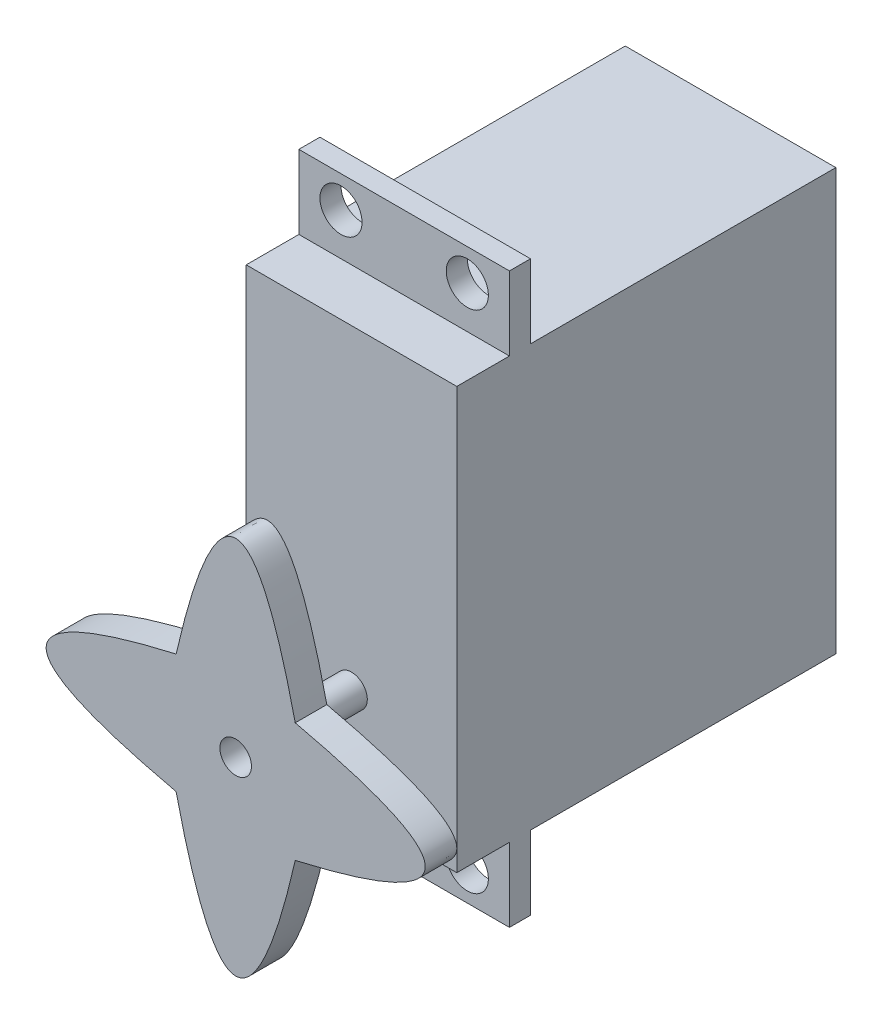
ISO-10303-21;
HEADER;
FILE_DESCRIPTION(('STEP AP214'),'2;1');
FILE_NAME('part.step','',(''),(''),'','','');
FILE_SCHEMA(('AUTOMOTIVE_DESIGN { 1 0 10303 214 1 1 1 1 }'));
ENDSEC;
DATA;
#1=APPLICATION_CONTEXT('core data for automotive mechanical design processes');
#2=APPLICATION_PROTOCOL_DEFINITION('international standard','automotive_design',2000,#1);
#3=PRODUCT_CONTEXT('',#1,'mechanical');
#4=PRODUCT('Part','Part','',(#3));
#5=PRODUCT_RELATED_PRODUCT_CATEGORY('part','',(#4));
#6=PRODUCT_DEFINITION_FORMATION('','',#4);
#7=PRODUCT_DEFINITION_CONTEXT('part definition',#1,'design');
#8=PRODUCT_DEFINITION('design','',#6,#7);
#9=PRODUCT_DEFINITION_SHAPE('','',#8);
#10=(LENGTH_UNIT() NAMED_UNIT(*) SI_UNIT(.MILLI.,.METRE.));
#11=(NAMED_UNIT(*) PLANE_ANGLE_UNIT() SI_UNIT($,.RADIAN.));
#12=(NAMED_UNIT(*) SI_UNIT($,.STERADIAN.) SOLID_ANGLE_UNIT());
#13=UNCERTAINTY_MEASURE_WITH_UNIT(LENGTH_MEASURE(1.E-05),#10,'distance_accuracy_value','');
#14=(GEOMETRIC_REPRESENTATION_CONTEXT(3) GLOBAL_UNCERTAINTY_ASSIGNED_CONTEXT((#13)) GLOBAL_UNIT_ASSIGNED_CONTEXT((#10,
#11,#12)) REPRESENTATION_CONTEXT('',''));
#15=CARTESIAN_POINT('',(0.,0.,0.));
#16=DIRECTION('',(0.,0.,1.));
#17=DIRECTION('',(1.,0.,0.));
#18=AXIS2_PLACEMENT_3D('',#15,#16,#17);
#19=CARTESIAN_POINT('',(15.6568542494924,4.34314575050762,47.));
#20=CARTESIAN_POINT('',(40.3431457505076,10.,47.));
#21=CARTESIAN_POINT('',(15.6568542494924,15.6568542494924,47.));
#22=B_SPLINE_CURVE_WITH_KNOTS('',2,(#19,#20,#21),.UNSPECIFIED.,.F.,.F.,(3,3),(0.,1.),.UNSPECIFIED.);
#23=DIRECTION('',(0.,0.,-1.));
#24=VECTOR('',#23,1.);
#25=SURFACE_OF_LINEAR_EXTRUSION('',#22,#24);
#26=CARTESIAN_POINT('',(15.6568542494924,4.34314575050762,44.));
#27=CARTESIAN_POINT('',(40.3431457505076,10.,44.));
#28=CARTESIAN_POINT('',(15.6568542494924,15.6568542494924,44.));
#29=B_SPLINE_CURVE_WITH_KNOTS('',2,(#26,#27,#28),.UNSPECIFIED.,.F.,.F.,(3,3),(0.,1.),.UNSPECIFIED.);
#30=CARTESIAN_POINT('',(15.6568542494923,4.34314575050757,44.));
#31=VERTEX_POINT('',#30);
#32=CARTESIAN_POINT('',(15.6568542494924,15.6568542494924,44.));
#33=VERTEX_POINT('',#32);
#34=EDGE_CURVE('E136',#31,#33,#29,.T.);
#35=ORIENTED_EDGE('',*,*,#34,.T.);
#36=DIRECTION('',(0.,0.,-1.));
#37=VECTOR('',#36,1.);
#38=CARTESIAN_POINT('',(15.6568542494924,15.6568542494924,47.));
#39=LINE('',#38,#37);
#40=CARTESIAN_POINT('',(15.6568542494924,15.6568542494924,47.));
#41=VERTEX_POINT('',#40);
#42=EDGE_CURVE('E12',#41,#33,#39,.T.);
#43=ORIENTED_EDGE('',*,*,#42,.F.);
#44=CARTESIAN_POINT('',(15.6568542494923,4.34314575050757,47.));
#45=VERTEX_POINT('',#44);
#46=EDGE_CURVE('E87',#45,#41,#22,.T.);
#47=ORIENTED_EDGE('',*,*,#46,.F.);
#48=DIRECTION('',(0.,0.,-1.));
#49=VECTOR('',#48,1.);
#50=CARTESIAN_POINT('',(15.6568542494923,4.34314575050757,47.));
#51=LINE('',#50,#49);
#52=EDGE_CURVE('E137',#45,#31,#51,.T.);
#53=ORIENTED_EDGE('',*,*,#52,.T.);
#54=EDGE_LOOP('',(#35,#43,#47,#53));
#55=FACE_BOUND('',#54,.T.);
#56=ADVANCED_FACE('F47',(#55),#25,.F.);
#57=CARTESIAN_POINT('',(4.34314575050761,15.6568542494924,47.));
#58=CARTESIAN_POINT('',(9.99999999999999,40.3431457505076,47.));
#59=CARTESIAN_POINT('',(15.6568542494924,15.6568542494924,47.));
#60=B_SPLINE_CURVE_WITH_KNOTS('',2,(#57,#58,#59),.UNSPECIFIED.,.F.,.F.,(3,3),(0.,1.),.UNSPECIFIED.);
#61=DIRECTION('',(0.,0.,-1.));
#62=VECTOR('',#61,1.);
#63=SURFACE_OF_LINEAR_EXTRUSION('',#60,#62);
#64=CARTESIAN_POINT('',(4.34314575050761,15.6568542494924,44.));
#65=CARTESIAN_POINT('',(9.99999999999999,40.3431457505076,44.));
#66=CARTESIAN_POINT('',(15.6568542494924,15.6568542494924,44.));
#67=B_SPLINE_CURVE_WITH_KNOTS('',2,(#64,#65,#66),.UNSPECIFIED.,.F.,.F.,(3,3),(0.,1.),.UNSPECIFIED.);
#68=CARTESIAN_POINT('',(4.34314575050763,15.6568542494924,44.));
#69=VERTEX_POINT('',#68);
#70=EDGE_CURVE('E96',#69,#33,#67,.T.);
#71=ORIENTED_EDGE('',*,*,#70,.F.);
#72=DIRECTION('',(0.,0.,-1.));
#73=VECTOR('',#72,1.);
#74=CARTESIAN_POINT('',(4.34314575050763,15.6568542494924,47.));
#75=LINE('',#74,#73);
#76=CARTESIAN_POINT('',(4.34314575050763,15.6568542494924,47.));
#77=VERTEX_POINT('',#76);
#78=EDGE_CURVE('E56',#77,#69,#75,.T.);
#79=ORIENTED_EDGE('',*,*,#78,.F.);
#80=EDGE_CURVE('E94',#77,#41,#60,.T.);
#81=ORIENTED_EDGE('',*,*,#80,.T.);
#82=ORIENTED_EDGE('',*,*,#42,.T.);
#83=EDGE_LOOP('',(#71,#79,#81,#82));
#84=FACE_BOUND('',#83,.T.);
#85=ADVANCED_FACE('F93',(#84),#63,.T.);
#86=CARTESIAN_POINT('',(4.34314575050762,4.34314575050761,47.));
#87=CARTESIAN_POINT('',(-20.3431457505076,10.,47.));
#88=CARTESIAN_POINT('',(4.34314575050761,15.6568542494924,47.));
#89=B_SPLINE_CURVE_WITH_KNOTS('',2,(#86,#87,#88),.UNSPECIFIED.,.F.,.F.,(3,3),(0.,1.),.UNSPECIFIED.);
#90=DIRECTION('',(0.,0.,-1.));
#91=VECTOR('',#90,1.);
#92=SURFACE_OF_LINEAR_EXTRUSION('',#89,#91);
#93=CARTESIAN_POINT('',(4.34314575050762,4.34314575050761,44.));
#94=CARTESIAN_POINT('',(-20.3431457505076,10.,44.));
#95=CARTESIAN_POINT('',(4.34314575050761,15.6568542494924,44.));
#96=B_SPLINE_CURVE_WITH_KNOTS('',2,(#93,#94,#95),.UNSPECIFIED.,.F.,.F.,(3,3),(0.,1.),.UNSPECIFIED.);
#97=CARTESIAN_POINT('',(4.34314575050755,4.34314575050769,44.));
#98=VERTEX_POINT('',#97);
#99=EDGE_CURVE('E142',#98,#69,#96,.T.);
#100=ORIENTED_EDGE('',*,*,#99,.F.);
#101=DIRECTION('',(0.,0.,-1.));
#102=VECTOR('',#101,1.);
#103=CARTESIAN_POINT('',(4.34314575050755,4.34314575050769,47.));
#104=LINE('',#103,#102);
#105=CARTESIAN_POINT('',(4.34314575050755,4.34314575050769,47.));
#106=VERTEX_POINT('',#105);
#107=EDGE_CURVE('E79',#106,#98,#104,.T.);
#108=ORIENTED_EDGE('',*,*,#107,.F.);
#109=EDGE_CURVE('E103',#106,#77,#89,.T.);
#110=ORIENTED_EDGE('',*,*,#109,.T.);
#111=ORIENTED_EDGE('',*,*,#78,.T.);
#112=EDGE_LOOP('',(#100,#108,#110,#111));
#113=FACE_BOUND('',#112,.T.);
#114=ADVANCED_FACE('F105',(#113),#92,.T.);
#115=CARTESIAN_POINT('',(4.34314575050762,4.34314575050761,47.));
#116=CARTESIAN_POINT('',(10.,-20.3431457505076,47.));
#117=CARTESIAN_POINT('',(15.6568542494924,4.34314575050762,47.));
#118=B_SPLINE_CURVE_WITH_KNOTS('',2,(#115,#116,#117),.UNSPECIFIED.,.F.,.F.,(3,3),(0.,1.),.UNSPECIFIED.);
#119=DIRECTION('',(0.,0.,-1.));
#120=VECTOR('',#119,1.);
#121=SURFACE_OF_LINEAR_EXTRUSION('',#118,#120);
#122=CARTESIAN_POINT('',(4.34314575050762,4.34314575050761,44.));
#123=CARTESIAN_POINT('',(10.,-20.3431457505076,44.));
#124=CARTESIAN_POINT('',(15.6568542494924,4.34314575050762,44.));
#125=B_SPLINE_CURVE_WITH_KNOTS('',2,(#122,#123,#124),.UNSPECIFIED.,.F.,.F.,(3,3),(0.,1.),.UNSPECIFIED.);
#126=EDGE_CURVE('E82',#98,#31,#125,.T.);
#127=ORIENTED_EDGE('',*,*,#126,.T.);
#128=ORIENTED_EDGE('',*,*,#52,.F.);
#129=EDGE_CURVE('E64',#106,#45,#118,.T.);
#130=ORIENTED_EDGE('',*,*,#129,.F.);
#131=ORIENTED_EDGE('',*,*,#107,.T.);
#132=EDGE_LOOP('',(#127,#128,#130,#131));
#133=FACE_BOUND('',#132,.T.);
#134=ADVANCED_FACE('F125',(#133),#121,.F.);
#135=CARTESIAN_POINT('',(10.,10.,47.));
#136=DIRECTION('',(0.,0.,-1.));
#137=DIRECTION('',(-1.,0.,0.));
#138=AXIS2_PLACEMENT_3D('',#135,#136,#137);
#139=CYLINDRICAL_SURFACE('',#138,1.5);
#140=CARTESIAN_POINT('',(10.,10.,47.));
#141=DIRECTION('',(0.,0.,1.));
#142=DIRECTION('',(1.,0.,0.));
#143=AXIS2_PLACEMENT_3D('',#140,#141,#142);
#144=CIRCLE('',#143,1.5);
#145=CARTESIAN_POINT('',(11.5,10.,47.));
#146=VERTEX_POINT('',#145);
#147=EDGE_CURVE('E107',#146,#146,#144,.T.);
#148=ORIENTED_EDGE('',*,*,#147,.T.);
#149=EDGE_LOOP('',(#148));
#150=FACE_BOUND('',#149,.T.);
#151=CARTESIAN_POINT('',(10.,10.,44.));
#152=DIRECTION('',(0.,0.,1.));
#153=DIRECTION('',(1.,0.,0.));
#154=AXIS2_PLACEMENT_3D('',#151,#152,#153);
#155=CIRCLE('',#154,1.5);
#156=CARTESIAN_POINT('',(11.5,10.,44.));
#157=VERTEX_POINT('',#156);
#158=EDGE_CURVE('E161',#157,#157,#155,.T.);
#159=ORIENTED_EDGE('',*,*,#158,.F.);
#160=EDGE_LOOP('',(#159));
#161=FACE_BOUND('',#160,.T.);
#162=ADVANCED_FACE('F171',(#150,#161),#139,.F.);
#163=CARTESIAN_POINT('',(0.,0.,47.));
#164=DIRECTION('',(0.,0.,1.));
#165=DIRECTION('',(1.,0.,0.));
#166=AXIS2_PLACEMENT_3D('',#163,#164,#165);
#167=PLANE('',#166);
#168=ORIENTED_EDGE('',*,*,#46,.T.);
#169=ORIENTED_EDGE('',*,*,#80,.F.);
#170=ORIENTED_EDGE('',*,*,#109,.F.);
#171=ORIENTED_EDGE('',*,*,#129,.T.);
#172=EDGE_LOOP('',(#168,#169,#170,#171));
#173=FACE_BOUND('',#172,.T.);
#174=ORIENTED_EDGE('',*,*,#147,.F.);
#175=EDGE_LOOP('',(#174));
#176=FACE_BOUND('',#175,.T.);
#177=ADVANCED_FACE('F101',(#173,#176),#167,.T.);
#178=CARTESIAN_POINT('',(0.,0.,44.));
#179=DIRECTION('',(0.,0.,1.));
#180=DIRECTION('',(1.,0.,0.));
#181=AXIS2_PLACEMENT_3D('',#178,#179,#180);
#182=PLANE('',#181);
#183=ORIENTED_EDGE('',*,*,#34,.F.);
#184=ORIENTED_EDGE('',*,*,#126,.F.);
#185=ORIENTED_EDGE('',*,*,#99,.T.);
#186=ORIENTED_EDGE('',*,*,#70,.T.);
#187=EDGE_LOOP('',(#183,#184,#185,#186));
#188=FACE_BOUND('',#187,.T.);
#189=ORIENTED_EDGE('',*,*,#158,.T.);
#190=EDGE_LOOP('',(#189));
#191=FACE_BOUND('',#190,.T.);
#192=ADVANCED_FACE('F140',(#188,#191),#182,.F.);
#193=CLOSED_SHELL('',(#56,#85,#114,#134,#162,#177,#192));
#194=MANIFOLD_SOLID_BREP('B2',#193);
#195=CARTESIAN_POINT('',(0.,0.,36.));
#196=DIRECTION('',(0.,1.,0.));
#197=DIRECTION('',(0.,0.,1.));
#198=AXIS2_PLACEMENT_3D('',#195,#196,#197);
#199=PLANE('',#198);
#200=DIRECTION('',(0.,0.,-1.));
#201=VECTOR('',#200,1.);
#202=CARTESIAN_POINT('',(0.,0.,36.));
#203=LINE('',#202,#201);
#204=CARTESIAN_POINT('',(0.,0.,36.));
#205=VERTEX_POINT('',#204);
#206=CARTESIAN_POINT('',(0.,0.,31.));
#207=VERTEX_POINT('',#206);
#208=EDGE_CURVE('E502',#205,#207,#203,.T.);
#209=ORIENTED_EDGE('',*,*,#208,.T.);
#210=DIRECTION('',(1.,0.,0.));
#211=VECTOR('',#210,1.);
#212=CARTESIAN_POINT('',(0.,0.,31.));
#213=LINE('',#212,#211);
#214=CARTESIAN_POINT('',(20.,0.,31.));
#215=VERTEX_POINT('',#214);
#216=EDGE_CURVE('E467',#207,#215,#213,.T.);
#217=ORIENTED_EDGE('',*,*,#216,.T.);
#218=DIRECTION('',(0.,0.,-1.));
#219=VECTOR('',#218,1.);
#220=CARTESIAN_POINT('',(20.,0.,36.));
#221=LINE('',#220,#219);
#222=CARTESIAN_POINT('',(20.,0.,36.));
#223=VERTEX_POINT('',#222);
#224=EDGE_CURVE('E499',#223,#215,#221,.T.);
#225=ORIENTED_EDGE('',*,*,#224,.F.);
#226=DIRECTION('',(1.,0.,0.));
#227=VECTOR('',#226,1.);
#228=CARTESIAN_POINT('',(0.,0.,36.));
#229=LINE('',#228,#227);
#230=EDGE_CURVE('E474',#205,#223,#229,.T.);
#231=ORIENTED_EDGE('',*,*,#230,.F.);
#232=EDGE_LOOP('',(#209,#217,#225,#231));
#233=FACE_BOUND('',#232,.T.);
#234=ADVANCED_FACE('F326',(#233),#199,.F.);
#235=CARTESIAN_POINT('',(0.,40.,36.));
#236=DIRECTION('',(0.,-1.,0.));
#237=DIRECTION('',(0.,0.,-1.));
#238=AXIS2_PLACEMENT_3D('',#235,#236,#237);
#239=PLANE('',#238);
#240=DIRECTION('',(0.,0.,-1.));
#241=VECTOR('',#240,1.);
#242=CARTESIAN_POINT('',(20.,40.,36.));
#243=LINE('',#242,#241);
#244=CARTESIAN_POINT('',(20.,40.,36.));
#245=VERTEX_POINT('',#244);
#246=CARTESIAN_POINT('',(20.,40.,31.));
#247=VERTEX_POINT('',#246);
#248=EDGE_CURVE('E495',#245,#247,#243,.T.);
#249=ORIENTED_EDGE('',*,*,#248,.T.);
#250=DIRECTION('',(-1.,0.,0.));
#251=VECTOR('',#250,1.);
#252=CARTESIAN_POINT('',(0.,40.,31.));
#253=LINE('',#252,#251);
#254=CARTESIAN_POINT('',(0.,40.,31.));
#255=VERTEX_POINT('',#254);
#256=EDGE_CURVE('E334',#247,#255,#253,.T.);
#257=ORIENTED_EDGE('',*,*,#256,.T.);
#258=DIRECTION('',(0.,0.,-1.));
#259=VECTOR('',#258,1.);
#260=CARTESIAN_POINT('',(0.,40.,36.));
#261=LINE('',#260,#259);
#262=CARTESIAN_POINT('',(0.,40.,36.));
#263=VERTEX_POINT('',#262);
#264=EDGE_CURVE('E491',#263,#255,#261,.T.);
#265=ORIENTED_EDGE('',*,*,#264,.F.);
#266=DIRECTION('',(-1.,0.,0.));
#267=VECTOR('',#266,1.);
#268=CARTESIAN_POINT('',(0.,40.,36.));
#269=LINE('',#268,#267);
#270=EDGE_CURVE('E479',#245,#263,#269,.T.);
#271=ORIENTED_EDGE('',*,*,#270,.F.);
#272=EDGE_LOOP('',(#249,#257,#265,#271));
#273=FACE_BOUND('',#272,.T.);
#274=ADVANCED_FACE('F509',(#273),#239,.F.);
#275=CARTESIAN_POINT('',(0.,0.,36.));
#276=DIRECTION('',(1.,0.,0.));
#277=DIRECTION('',(0.,0.,-1.));
#278=AXIS2_PLACEMENT_3D('',#275,#276,#277);
#279=PLANE('',#278);
#280=CARTESIAN_POINT('',(0.,0.,29.));
#281=VERTEX_POINT('',#280);
#282=CARTESIAN_POINT('',(0.,0.,0.));
#283=VERTEX_POINT('',#282);
#284=EDGE_CURVE('E419',#281,#283,#203,.T.);
#285=ORIENTED_EDGE('',*,*,#284,.F.);
#286=DIRECTION('',(0.,-1.,0.));
#287=VECTOR('',#286,1.);
#288=CARTESIAN_POINT('',(0.,47.,29.));
#289=LINE('',#288,#287);
#290=CARTESIAN_POINT('',(0.,-7.,29.));
#291=VERTEX_POINT('',#290);
#292=EDGE_CURVE('E341',#281,#291,#289,.T.);
#293=ORIENTED_EDGE('',*,*,#292,.T.);
#294=DIRECTION('',(0.,0.,-1.));
#295=VECTOR('',#294,1.);
#296=CARTESIAN_POINT('',(0.,-7.,29.));
#297=LINE('',#296,#295);
#298=CARTESIAN_POINT('',(0.,-7.,31.));
#299=VERTEX_POINT('',#298);
#300=EDGE_CURVE('E417',#299,#291,#297,.T.);
#301=ORIENTED_EDGE('',*,*,#300,.F.);
#302=DIRECTION('',(0.,-1.,0.));
#303=VECTOR('',#302,1.);
#304=CARTESIAN_POINT('',(0.,47.,31.));
#305=LINE('',#304,#303);
#306=EDGE_CURVE('E459',#207,#299,#305,.T.);
#307=ORIENTED_EDGE('',*,*,#306,.F.);
#308=ORIENTED_EDGE('',*,*,#208,.F.);
#309=DIRECTION('',(0.,-1.,0.));
#310=VECTOR('',#309,1.);
#311=CARTESIAN_POINT('',(0.,0.,36.));
#312=LINE('',#311,#310);
#313=EDGE_CURVE('E471',#263,#205,#312,.T.);
#314=ORIENTED_EDGE('',*,*,#313,.F.);
#315=ORIENTED_EDGE('',*,*,#264,.T.);
#316=CARTESIAN_POINT('',(0.,47.,31.));
#317=VERTEX_POINT('',#316);
#318=EDGE_CURVE('E456',#317,#255,#305,.T.);
#319=ORIENTED_EDGE('',*,*,#318,.F.);
#320=DIRECTION('',(0.,0.,-1.));
#321=VECTOR('',#320,1.);
#322=CARTESIAN_POINT('',(0.,47.,29.));
#323=LINE('',#322,#321);
#324=CARTESIAN_POINT('',(0.,47.,29.));
#325=VERTEX_POINT('',#324);
#326=EDGE_CURVE('E446',#317,#325,#323,.T.);
#327=ORIENTED_EDGE('',*,*,#326,.T.);
#328=CARTESIAN_POINT('',(0.,40.,29.));
#329=VERTEX_POINT('',#328);
#330=EDGE_CURVE('E420',#325,#329,#289,.T.);
#331=ORIENTED_EDGE('',*,*,#330,.T.);
#332=CARTESIAN_POINT('',(0.,40.,0.));
#333=VERTEX_POINT('',#332);
#334=EDGE_CURVE('E481',#329,#333,#261,.T.);
#335=ORIENTED_EDGE('',*,*,#334,.T.);
#336=DIRECTION('',(0.,-1.,0.));
#337=VECTOR('',#336,1.);
#338=CARTESIAN_POINT('',(0.,0.,0.));
#339=LINE('',#338,#337);
#340=EDGE_CURVE('E470',#333,#283,#339,.T.);
#341=ORIENTED_EDGE('',*,*,#340,.T.);
#342=EDGE_LOOP('',(#285,#293,#301,#307,#308,#314,#315,#319,#327,#331,#335,#341));
#343=FACE_BOUND('',#342,.T.);
#344=ADVANCED_FACE('F328',(#343),#279,.F.);
#345=CARTESIAN_POINT('',(20.,0.,29.));
#346=VERTEX_POINT('',#345);
#347=CARTESIAN_POINT('',(20.,0.,0.));
#348=VERTEX_POINT('',#347);
#349=EDGE_CURVE('E498',#346,#348,#221,.T.);
#350=ORIENTED_EDGE('',*,*,#349,.F.);
#351=DIRECTION('',(-1.,0.,0.));
#352=VECTOR('',#351,1.);
#353=CARTESIAN_POINT('',(0.,0.,29.));
#354=LINE('',#353,#352);
#355=EDGE_CURVE('E458',#346,#281,#354,.T.);
#356=ORIENTED_EDGE('',*,*,#355,.T.);
#357=ORIENTED_EDGE('',*,*,#284,.T.);
#358=DIRECTION('',(1.,0.,0.));
#359=VECTOR('',#358,1.);
#360=CARTESIAN_POINT('',(0.,0.,0.));
#361=LINE('',#360,#359);
#362=EDGE_CURVE('E483',#283,#348,#361,.T.);
#363=ORIENTED_EDGE('',*,*,#362,.T.);
#364=EDGE_LOOP('',(#350,#356,#357,#363));
#365=FACE_BOUND('',#364,.T.);
#366=ADVANCED_FACE('F540',(#365),#199,.F.);
#367=CARTESIAN_POINT('',(20.,0.,36.));
#368=DIRECTION('',(-1.,0.,0.));
#369=DIRECTION('',(0.,0.,1.));
#370=AXIS2_PLACEMENT_3D('',#367,#368,#369);
#371=PLANE('',#370);
#372=CARTESIAN_POINT('',(20.,40.,29.));
#373=VERTEX_POINT('',#372);
#374=CARTESIAN_POINT('',(20.,40.,0.));
#375=VERTEX_POINT('',#374);
#376=EDGE_CURVE('E494',#373,#375,#243,.T.);
#377=ORIENTED_EDGE('',*,*,#376,.F.);
#378=DIRECTION('',(0.,-1.,0.));
#379=VECTOR('',#378,1.);
#380=CARTESIAN_POINT('',(20.,47.,29.));
#381=LINE('',#380,#379);
#382=CARTESIAN_POINT('',(20.,47.,29.));
#383=VERTEX_POINT('',#382);
#384=EDGE_CURVE('E349',#383,#373,#381,.T.);
#385=ORIENTED_EDGE('',*,*,#384,.F.);
#386=DIRECTION('',(0.,0.,1.));
#387=VECTOR('',#386,1.);
#388=CARTESIAN_POINT('',(20.,47.,29.));
#389=LINE('',#388,#387);
#390=CARTESIAN_POINT('',(20.,47.,31.));
#391=VERTEX_POINT('',#390);
#392=EDGE_CURVE('E451',#383,#391,#389,.T.);
#393=ORIENTED_EDGE('',*,*,#392,.T.);
#394=DIRECTION('',(0.,-1.,0.));
#395=VECTOR('',#394,1.);
#396=CARTESIAN_POINT('',(20.,47.,31.));
#397=LINE('',#396,#395);
#398=EDGE_CURVE('E460',#391,#247,#397,.T.);
#399=ORIENTED_EDGE('',*,*,#398,.T.);
#400=ORIENTED_EDGE('',*,*,#248,.F.);
#401=DIRECTION('',(0.,1.,0.));
#402=VECTOR('',#401,1.);
#403=CARTESIAN_POINT('',(20.,0.,36.));
#404=LINE('',#403,#402);
#405=EDGE_CURVE('E477',#223,#245,#404,.T.);
#406=ORIENTED_EDGE('',*,*,#405,.F.);
#407=ORIENTED_EDGE('',*,*,#224,.T.);
#408=CARTESIAN_POINT('',(20.,-7.,31.));
#409=VERTEX_POINT('',#408);
#410=EDGE_CURVE('E463',#215,#409,#397,.T.);
#411=ORIENTED_EDGE('',*,*,#410,.T.);
#412=DIRECTION('',(0.,0.,1.));
#413=VECTOR('',#412,1.);
#414=CARTESIAN_POINT('',(20.,-7.,29.));
#415=LINE('',#414,#413);
#416=CARTESIAN_POINT('',(20.,-7.,29.));
#417=VERTEX_POINT('',#416);
#418=EDGE_CURVE('E431',#417,#409,#415,.T.);
#419=ORIENTED_EDGE('',*,*,#418,.F.);
#420=EDGE_CURVE('E427',#346,#417,#381,.T.);
#421=ORIENTED_EDGE('',*,*,#420,.F.);
#422=ORIENTED_EDGE('',*,*,#349,.T.);
#423=DIRECTION('',(0.,1.,0.));
#424=VECTOR('',#423,1.);
#425=CARTESIAN_POINT('',(20.,0.,0.));
#426=LINE('',#425,#424);
#427=EDGE_CURVE('E486',#348,#375,#426,.T.);
#428=ORIENTED_EDGE('',*,*,#427,.T.);
#429=EDGE_LOOP('',(#377,#385,#393,#399,#400,#406,#407,#411,#419,#421,#422,#428));
#430=FACE_BOUND('',#429,.T.);
#431=ADVANCED_FACE('F522',(#430),#371,.F.);
#432=ORIENTED_EDGE('',*,*,#334,.F.);
#433=DIRECTION('',(1.,0.,0.));
#434=VECTOR('',#433,1.);
#435=CARTESIAN_POINT('',(0.,40.,29.));
#436=LINE('',#435,#434);
#437=EDGE_CURVE('E505',#329,#373,#436,.T.);
#438=ORIENTED_EDGE('',*,*,#437,.T.);
#439=ORIENTED_EDGE('',*,*,#376,.T.);
#440=DIRECTION('',(-1.,0.,0.));
#441=VECTOR('',#440,1.);
#442=CARTESIAN_POINT('',(0.,40.,0.));
#443=LINE('',#442,#441);
#444=EDGE_CURVE('E475',#375,#333,#443,.T.);
#445=ORIENTED_EDGE('',*,*,#444,.T.);
#446=EDGE_LOOP('',(#432,#438,#439,#445));
#447=FACE_BOUND('',#446,.T.);
#448=ADVANCED_FACE('F531',(#447),#239,.F.);
#449=CARTESIAN_POINT('',(0.,0.,36.));
#450=DIRECTION('',(0.,0.,-1.));
#451=DIRECTION('',(-1.,0.,0.));
#452=AXIS2_PLACEMENT_3D('',#449,#450,#451);
#453=PLANE('',#452);
#454=CARTESIAN_POINT('',(10.,10.,36.));
#455=DIRECTION('',(0.,0.,-1.));
#456=DIRECTION('',(-1.,0.,0.));
#457=AXIS2_PLACEMENT_3D('',#454,#455,#456);
#458=CIRCLE('',#457,1.5);
#459=CARTESIAN_POINT('',(8.5,10.,36.));
#460=VERTEX_POINT('',#459);
#461=EDGE_CURVE('E45',#460,#460,#458,.F.);
#462=ORIENTED_EDGE('',*,*,#461,.F.);
#463=EDGE_LOOP('',(#462));
#464=FACE_BOUND('',#463,.T.);
#465=ORIENTED_EDGE('',*,*,#313,.T.);
#466=ORIENTED_EDGE('',*,*,#230,.T.);
#467=ORIENTED_EDGE('',*,*,#405,.T.);
#468=ORIENTED_EDGE('',*,*,#270,.T.);
#469=EDGE_LOOP('',(#465,#466,#467,#468));
#470=FACE_BOUND('',#469,.T.);
#471=ADVANCED_FACE('F517',(#464,#470),#453,.F.);
#472=CARTESIAN_POINT('',(0.,0.,0.));
#473=DIRECTION('',(0.,0.,-1.));
#474=DIRECTION('',(-1.,0.,0.));
#475=AXIS2_PLACEMENT_3D('',#472,#473,#474);
#476=PLANE('',#475);
#477=ORIENTED_EDGE('',*,*,#340,.F.);
#478=ORIENTED_EDGE('',*,*,#444,.F.);
#479=ORIENTED_EDGE('',*,*,#427,.F.);
#480=ORIENTED_EDGE('',*,*,#362,.F.);
#481=EDGE_LOOP('',(#477,#478,#479,#480));
#482=FACE_BOUND('',#481,.T.);
#483=ADVANCED_FACE('F537',(#482),#476,.T.);
#484=CARTESIAN_POINT('',(0.,47.,0.));
#485=DIRECTION('',(0.,1.,0.));
#486=DIRECTION('',(0.,0.,1.));
#487=AXIS2_PLACEMENT_3D('',#484,#485,#486);
#488=PLANE('',#487);
#489=ORIENTED_EDGE('',*,*,#326,.F.);
#490=DIRECTION('',(-1.,0.,0.));
#491=VECTOR('',#490,1.);
#492=CARTESIAN_POINT('',(0.,47.,31.));
#493=LINE('',#492,#491);
#494=EDGE_CURVE('E421',#391,#317,#493,.T.);
#495=ORIENTED_EDGE('',*,*,#494,.F.);
#496=ORIENTED_EDGE('',*,*,#392,.F.);
#497=DIRECTION('',(1.,0.,0.));
#498=VECTOR('',#497,1.);
#499=CARTESIAN_POINT('',(0.,47.,29.));
#500=LINE('',#499,#498);
#501=EDGE_CURVE('E449',#325,#383,#500,.T.);
#502=ORIENTED_EDGE('',*,*,#501,.F.);
#503=EDGE_LOOP('',(#489,#495,#496,#502));
#504=FACE_BOUND('',#503,.T.);
#505=ADVANCED_FACE('F527',(#504),#488,.T.);
#506=CARTESIAN_POINT('',(0.,47.,29.));
#507=DIRECTION('',(0.,0.,-1.));
#508=DIRECTION('',(-1.,0.,0.));
#509=AXIS2_PLACEMENT_3D('',#506,#507,#508);
#510=PLANE('',#509);
#511=CARTESIAN_POINT('',(16.,44.,29.));
#512=DIRECTION('',(0.,0.,-1.));
#513=DIRECTION('',(-1.,0.,0.));
#514=AXIS2_PLACEMENT_3D('',#511,#512,#513);
#515=CIRCLE('',#514,2.);
#516=CARTESIAN_POINT('',(14.,44.,29.));
#517=VERTEX_POINT('',#516);
#518=EDGE_CURVE('E742',#517,#517,#515,.F.);
#519=ORIENTED_EDGE('',*,*,#518,.T.);
#520=EDGE_LOOP('',(#519));
#521=FACE_BOUND('',#520,.T.);
#522=CARTESIAN_POINT('',(4.,44.,29.));
#523=DIRECTION('',(0.,0.,-1.));
#524=DIRECTION('',(-1.,0.,0.));
#525=AXIS2_PLACEMENT_3D('',#522,#523,#524);
#526=CIRCLE('',#525,2.);
#527=CARTESIAN_POINT('',(2.,44.,29.));
#528=VERTEX_POINT('',#527);
#529=EDGE_CURVE('E727',#528,#528,#526,.F.);
#530=ORIENTED_EDGE('',*,*,#529,.T.);
#531=EDGE_LOOP('',(#530));
#532=FACE_BOUND('',#531,.T.);
#533=ORIENTED_EDGE('',*,*,#437,.F.);
#534=ORIENTED_EDGE('',*,*,#330,.F.);
#535=ORIENTED_EDGE('',*,*,#501,.T.);
#536=ORIENTED_EDGE('',*,*,#384,.T.);
#537=EDGE_LOOP('',(#533,#534,#535,#536));
#538=FACE_BOUND('',#537,.T.);
#539=ADVANCED_FACE('F586',(#521,#532,#538),#510,.T.);
#540=CARTESIAN_POINT('',(0.,47.,31.));
#541=DIRECTION('',(0.,0.,1.));
#542=DIRECTION('',(1.,0.,0.));
#543=AXIS2_PLACEMENT_3D('',#540,#541,#542);
#544=PLANE('',#543);
#545=CARTESIAN_POINT('',(16.,44.,31.));
#546=DIRECTION('',(0.,0.,1.));
#547=DIRECTION('',(1.,0.,0.));
#548=AXIS2_PLACEMENT_3D('',#545,#546,#547);
#549=CIRCLE('',#548,2.);
#550=CARTESIAN_POINT('',(18.,44.,31.));
#551=VERTEX_POINT('',#550);
#552=EDGE_CURVE('E739',#551,#551,#549,.T.);
#553=ORIENTED_EDGE('',*,*,#552,.F.);
#554=EDGE_LOOP('',(#553));
#555=FACE_BOUND('',#554,.T.);
#556=CARTESIAN_POINT('',(4.,44.,31.));
#557=DIRECTION('',(0.,0.,1.));
#558=DIRECTION('',(1.,0.,0.));
#559=AXIS2_PLACEMENT_3D('',#556,#557,#558);
#560=CIRCLE('',#559,2.);
#561=CARTESIAN_POINT('',(6.,44.,31.));
#562=VERTEX_POINT('',#561);
#563=EDGE_CURVE('E730',#562,#562,#560,.T.);
#564=ORIENTED_EDGE('',*,*,#563,.F.);
#565=EDGE_LOOP('',(#564));
#566=FACE_BOUND('',#565,.T.);
#567=ORIENTED_EDGE('',*,*,#256,.F.);
#568=ORIENTED_EDGE('',*,*,#398,.F.);
#569=ORIENTED_EDGE('',*,*,#494,.T.);
#570=ORIENTED_EDGE('',*,*,#318,.T.);
#571=EDGE_LOOP('',(#567,#568,#569,#570));
#572=FACE_BOUND('',#571,.T.);
#573=ADVANCED_FACE('F525',(#555,#566,#572),#544,.T.);
#574=CARTESIAN_POINT('',(16.,-4.,31.));
#575=DIRECTION('',(0.,0.,1.));
#576=DIRECTION('',(1.,0.,0.));
#577=AXIS2_PLACEMENT_3D('',#574,#575,#576);
#578=CIRCLE('',#577,2.);
#579=CARTESIAN_POINT('',(18.,-4.,31.));
#580=VERTEX_POINT('',#579);
#581=EDGE_CURVE('E733',#580,#580,#578,.T.);
#582=ORIENTED_EDGE('',*,*,#581,.F.);
#583=EDGE_LOOP('',(#582));
#584=FACE_BOUND('',#583,.T.);
#585=CARTESIAN_POINT('',(4.,-4.,31.));
#586=DIRECTION('',(0.,0.,1.));
#587=DIRECTION('',(1.,0.,0.));
#588=AXIS2_PLACEMENT_3D('',#585,#586,#587);
#589=CIRCLE('',#588,2.);
#590=CARTESIAN_POINT('',(6.,-4.,31.));
#591=VERTEX_POINT('',#590);
#592=EDGE_CURVE('E437',#591,#591,#589,.T.);
#593=ORIENTED_EDGE('',*,*,#592,.F.);
#594=EDGE_LOOP('',(#593));
#595=FACE_BOUND('',#594,.T.);
#596=ORIENTED_EDGE('',*,*,#216,.F.);
#597=ORIENTED_EDGE('',*,*,#306,.T.);
#598=DIRECTION('',(-1.,0.,0.));
#599=VECTOR('',#598,1.);
#600=CARTESIAN_POINT('',(0.,-7.,31.));
#601=LINE('',#600,#599);
#602=EDGE_CURVE('E436',#409,#299,#601,.T.);
#603=ORIENTED_EDGE('',*,*,#602,.F.);
#604=ORIENTED_EDGE('',*,*,#410,.F.);
#605=EDGE_LOOP('',(#596,#597,#603,#604));
#606=FACE_BOUND('',#605,.T.);
#607=ADVANCED_FACE('F542',(#584,#595,#606),#544,.T.);
#608=CARTESIAN_POINT('',(16.,-4.,29.));
#609=DIRECTION('',(0.,0.,-1.));
#610=DIRECTION('',(-1.,0.,0.));
#611=AXIS2_PLACEMENT_3D('',#608,#609,#610);
#612=CIRCLE('',#611,2.);
#613=CARTESIAN_POINT('',(14.,-4.,29.));
#614=VERTEX_POINT('',#613);
#615=EDGE_CURVE('E736',#614,#614,#612,.F.);
#616=ORIENTED_EDGE('',*,*,#615,.T.);
#617=EDGE_LOOP('',(#616));
#618=FACE_BOUND('',#617,.T.);
#619=CARTESIAN_POINT('',(4.,-4.,29.));
#620=DIRECTION('',(0.,0.,-1.));
#621=DIRECTION('',(-1.,0.,0.));
#622=AXIS2_PLACEMENT_3D('',#619,#620,#621);
#623=CIRCLE('',#622,2.);
#624=CARTESIAN_POINT('',(2.,-4.,29.));
#625=VERTEX_POINT('',#624);
#626=EDGE_CURVE('E440',#625,#625,#623,.F.);
#627=ORIENTED_EDGE('',*,*,#626,.T.);
#628=EDGE_LOOP('',(#627));
#629=FACE_BOUND('',#628,.T.);
#630=ORIENTED_EDGE('',*,*,#355,.F.);
#631=ORIENTED_EDGE('',*,*,#420,.T.);
#632=DIRECTION('',(1.,0.,0.));
#633=VECTOR('',#632,1.);
#634=CARTESIAN_POINT('',(0.,-7.,29.));
#635=LINE('',#634,#633);
#636=EDGE_CURVE('E424',#291,#417,#635,.T.);
#637=ORIENTED_EDGE('',*,*,#636,.F.);
#638=ORIENTED_EDGE('',*,*,#292,.F.);
#639=EDGE_LOOP('',(#630,#631,#637,#638));
#640=FACE_BOUND('',#639,.T.);
#641=ADVANCED_FACE('F425',(#618,#629,#640),#510,.T.);
#642=CARTESIAN_POINT('',(0.,-7.,0.));
#643=DIRECTION('',(0.,1.,0.));
#644=DIRECTION('',(0.,0.,1.));
#645=AXIS2_PLACEMENT_3D('',#642,#643,#644);
#646=PLANE('',#645);
#647=ORIENTED_EDGE('',*,*,#300,.T.);
#648=ORIENTED_EDGE('',*,*,#636,.T.);
#649=ORIENTED_EDGE('',*,*,#418,.T.);
#650=ORIENTED_EDGE('',*,*,#602,.T.);
#651=EDGE_LOOP('',(#647,#648,#649,#650));
#652=FACE_BOUND('',#651,.T.);
#653=ADVANCED_FACE('F434',(#652),#646,.F.);
#654=CARTESIAN_POINT('',(4.,-4.,-0.001000000000001));
#655=DIRECTION('',(0.,0.,1.));
#656=DIRECTION('',(1.,0.,0.));
#657=AXIS2_PLACEMENT_3D('',#654,#655,#656);
#658=CYLINDRICAL_SURFACE('',#657,2.);
#659=ORIENTED_EDGE('',*,*,#626,.F.);
#660=EDGE_LOOP('',(#659));
#661=FACE_BOUND('',#660,.T.);
#662=ORIENTED_EDGE('',*,*,#592,.T.);
#663=EDGE_LOOP('',(#662));
#664=FACE_BOUND('',#663,.T.);
#665=ADVANCED_FACE('F621',(#661,#664),#658,.F.);
#666=CARTESIAN_POINT('',(16.,-4.,-0.001000000000001));
#667=DIRECTION('',(0.,0.,1.));
#668=DIRECTION('',(1.,0.,0.));
#669=AXIS2_PLACEMENT_3D('',#666,#667,#668);
#670=CYLINDRICAL_SURFACE('',#669,2.);
#671=ORIENTED_EDGE('',*,*,#615,.F.);
#672=EDGE_LOOP('',(#671));
#673=FACE_BOUND('',#672,.T.);
#674=ORIENTED_EDGE('',*,*,#581,.T.);
#675=EDGE_LOOP('',(#674));
#676=FACE_BOUND('',#675,.T.);
#677=ADVANCED_FACE('F627',(#673,#676),#670,.F.);
#678=CARTESIAN_POINT('',(4.,44.,-0.001000000000001));
#679=DIRECTION('',(0.,0.,1.));
#680=DIRECTION('',(1.,0.,0.));
#681=AXIS2_PLACEMENT_3D('',#678,#679,#680);
#682=CYLINDRICAL_SURFACE('',#681,2.);
#683=ORIENTED_EDGE('',*,*,#529,.F.);
#684=EDGE_LOOP('',(#683));
#685=FACE_BOUND('',#684,.T.);
#686=ORIENTED_EDGE('',*,*,#563,.T.);
#687=EDGE_LOOP('',(#686));
#688=FACE_BOUND('',#687,.T.);
#689=ADVANCED_FACE('F635',(#685,#688),#682,.F.);
#690=CARTESIAN_POINT('',(16.,44.,-0.001000000000001));
#691=DIRECTION('',(0.,0.,1.));
#692=DIRECTION('',(1.,0.,0.));
#693=AXIS2_PLACEMENT_3D('',#690,#691,#692);
#694=CYLINDRICAL_SURFACE('',#693,2.);
#695=ORIENTED_EDGE('',*,*,#518,.F.);
#696=EDGE_LOOP('',(#695));
#697=FACE_BOUND('',#696,.T.);
#698=ORIENTED_EDGE('',*,*,#552,.T.);
#699=EDGE_LOOP('',(#698));
#700=FACE_BOUND('',#699,.T.);
#701=ADVANCED_FACE('F643',(#697,#700),#694,.F.);
#702=CARTESIAN_POINT('',(10.,10.,44.));
#703=DIRECTION('',(0.,0.,-1.));
#704=DIRECTION('',(-1.,0.,0.));
#705=AXIS2_PLACEMENT_3D('',#702,#703,#704);
#706=CYLINDRICAL_SURFACE('',#705,1.5);
#707=CARTESIAN_POINT('',(10.,10.,44.));
#708=DIRECTION('',(0.,0.,1.));
#709=DIRECTION('',(1.,0.,0.));
#710=AXIS2_PLACEMENT_3D('',#707,#708,#709);
#711=CIRCLE('',#710,1.5);
#712=CARTESIAN_POINT('',(11.5,10.,44.));
#713=VERTEX_POINT('',#712);
#714=EDGE_CURVE('E726',#713,#713,#711,.T.);
#715=ORIENTED_EDGE('',*,*,#714,.F.);
#716=EDGE_LOOP('',(#715));
#717=FACE_BOUND('',#716,.T.);
#718=ORIENTED_EDGE('',*,*,#461,.T.);
#719=EDGE_LOOP('',(#718));
#720=FACE_BOUND('',#719,.T.);
#721=ADVANCED_FACE('F651',(#717,#720),#706,.T.);
#722=CARTESIAN_POINT('',(10.,10.,44.));
#723=DIRECTION('',(0.,0.,1.));
#724=DIRECTION('',(1.,0.,0.));
#725=AXIS2_PLACEMENT_3D('',#722,#723,#724);
#726=PLANE('',#725);
#727=ORIENTED_EDGE('',*,*,#714,.T.);
#728=EDGE_LOOP('',(#727));
#729=FACE_BOUND('',#728,.T.);
#730=ADVANCED_FACE('F659',(#729),#726,.T.);
#731=CLOSED_SHELL('',(#234,#274,#344,#366,#431,#448,#471,#483,#505,#539,#573,#607,#641,#653,
#665,#677,#689,#701,#721,#730));
#732=MANIFOLD_SOLID_BREP('B6',#731);
#733=ADVANCED_BREP_SHAPE_REPRESENTATION('',(#18,#194,#732),#14);
#734=SHAPE_DEFINITION_REPRESENTATION(#9,#733);
ENDSEC;
END-ISO-10303-21;
